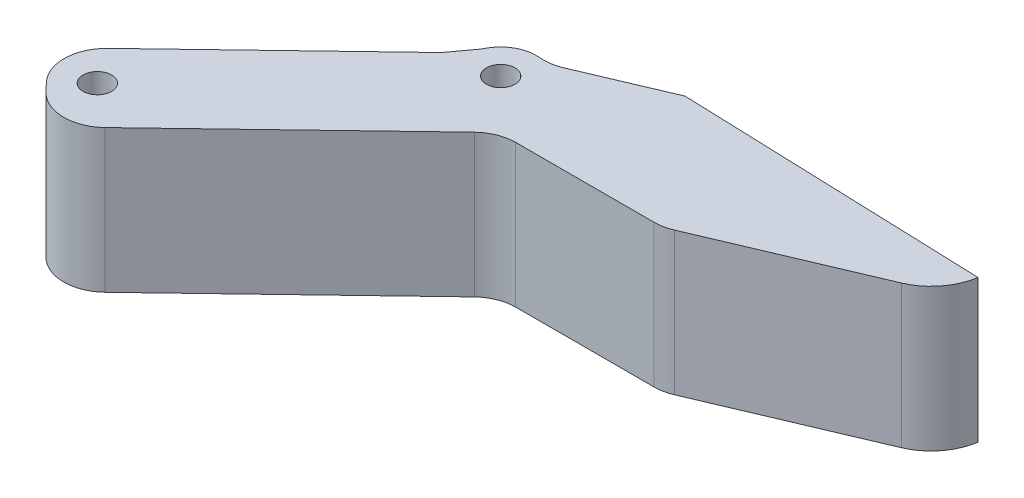
ISO-10303-21;
HEADER;
FILE_DESCRIPTION(('STEP AP214'),'2;1');
FILE_NAME('part.step','',(''),(''),'','','');
FILE_SCHEMA(('AUTOMOTIVE_DESIGN { 1 0 10303 214 1 1 1 1 }'));
ENDSEC;
DATA;
#1=APPLICATION_CONTEXT('core data for automotive mechanical design processes');
#2=APPLICATION_PROTOCOL_DEFINITION('international standard','automotive_design',2000,#1);
#3=PRODUCT_CONTEXT('',#1,'mechanical');
#4=PRODUCT('Part','Part','',(#3));
#5=PRODUCT_RELATED_PRODUCT_CATEGORY('part','',(#4));
#6=PRODUCT_DEFINITION_FORMATION('','',#4);
#7=PRODUCT_DEFINITION_CONTEXT('part definition',#1,'design');
#8=PRODUCT_DEFINITION('design','',#6,#7);
#9=PRODUCT_DEFINITION_SHAPE('','',#8);
#10=(LENGTH_UNIT() NAMED_UNIT(*) SI_UNIT(.MILLI.,.METRE.));
#11=(NAMED_UNIT(*) PLANE_ANGLE_UNIT() SI_UNIT($,.RADIAN.));
#12=(NAMED_UNIT(*) SI_UNIT($,.STERADIAN.) SOLID_ANGLE_UNIT());
#13=UNCERTAINTY_MEASURE_WITH_UNIT(LENGTH_MEASURE(1.E-05),#10,'distance_accuracy_value','');
#14=(GEOMETRIC_REPRESENTATION_CONTEXT(3) GLOBAL_UNCERTAINTY_ASSIGNED_CONTEXT((#13)) GLOBAL_UNIT_ASSIGNED_CONTEXT((#10,
#11,#12)) REPRESENTATION_CONTEXT('',''));
#15=CARTESIAN_POINT('',(0.,0.,0.));
#16=DIRECTION('',(0.,0.,1.));
#17=DIRECTION('',(1.,0.,0.));
#18=AXIS2_PLACEMENT_3D('',#15,#16,#17);
#19=CARTESIAN_POINT('',(-8.89,25.4,-1.26999999999998));
#20=DIRECTION('',(0.390731128489275,0.,0.92050485345244));
#21=DIRECTION('',(0.,-1.,0.));
#22=AXIS2_PLACEMENT_3D('',#19,#20,#21);
#23=PLANE('',#22);
#24=DIRECTION('',(-0.92050485345244,0.,0.390731128489275));
#25=VECTOR('',#24,1.);
#26=CARTESIAN_POINT('',(-8.89,0.,-1.26999999999998));
#27=LINE('',#26,#25);
#28=CARTESIAN_POINT('',(4.34638440568336,0.,-6.88851183788211));
#29=VERTEX_POINT('',#28);
#30=CARTESIAN_POINT('',(19.5010205659257,0.,-13.3212732367244));
#31=VERTEX_POINT('',#30);
#32=EDGE_CURVE('E180',#29,#31,#27,.F.);
#33=ORIENTED_EDGE('',*,*,#32,.F.);
#34=DIRECTION('',(0.,1.,0.));
#35=VECTOR('',#34,1.);
#36=CARTESIAN_POINT('',(4.34638440568335,25.4,-6.88851183788211));
#37=LINE('',#36,#35);
#38=CARTESIAN_POINT('',(4.34638440568335,25.4,-6.88851183788211));
#39=VERTEX_POINT('',#38);
#40=EDGE_CURVE('E236',#29,#39,#37,.T.);
#41=ORIENTED_EDGE('',*,*,#40,.T.);
#42=DIRECTION('',(0.92050485345244,0.,-0.390731128489275));
#43=VECTOR('',#42,1.);
#44=CARTESIAN_POINT('',(-1.8140243165248,25.4,-4.27357347774675));
#45=LINE('',#44,#43);
#46=CARTESIAN_POINT('',(19.5010205659257,25.4,-13.3212732367244));
#47=VERTEX_POINT('',#46);
#48=EDGE_CURVE('E179',#47,#39,#45,.F.);
#49=ORIENTED_EDGE('',*,*,#48,.F.);
#50=DIRECTION('',(0.,-1.,0.));
#51=VECTOR('',#50,1.);
#52=CARTESIAN_POINT('',(19.5010205659257,25.4,-13.3212732367244));
#53=LINE('',#52,#51);
#54=EDGE_CURVE('E186',#47,#31,#53,.T.);
#55=ORIENTED_EDGE('',*,*,#54,.T.);
#56=EDGE_LOOP('',(#33,#41,#49,#55));
#57=FACE_BOUND('',#56,.T.);
#58=ADVANCED_FACE('F39',(#57),#23,.F.);
#59=CARTESIAN_POINT('',(0.,25.4,0.));
#60=DIRECTION('',(0.,1.,0.));
#61=DIRECTION('',(0.,0.,1.));
#62=AXIS2_PLACEMENT_3D('',#59,#60,#61);
#63=PLANE('',#62);
#64=DIRECTION('',(0.590673831710925,0.,-0.806910419149446));
#65=VECTOR('',#64,1.);
#66=CARTESIAN_POINT('',(-5.80188098417422,25.4,-2.58082875167601));
#67=LINE('',#66,#65);
#68=CARTESIAN_POINT('',(-8.49451664572613,25.4,1.09753933174861));
#69=VERTEX_POINT('',#68);
#70=CARTESIAN_POINT('',(-6.18933525078564,25.4,-2.05153344877241));
#71=VERTEX_POINT('',#70);
#72=EDGE_CURVE('E260',#69,#71,#67,.T.);
#73=ORIENTED_EDGE('',*,*,#72,.F.);
#74=CARTESIAN_POINT('',(-14.6431740396449,25.4,-3.40339526588864));
#75=DIRECTION('',(0.,1.,0.));
#76=DIRECTION('',(0.,0.,1.));
#77=AXIS2_PLACEMENT_3D('',#74,#75,#76);
#78=CIRCLE('',#77,7.62);
#79=CARTESIAN_POINT('',(-9.37363864555082,25.4,2.1008210026086));
#80=VERTEX_POINT('',#79);
#81=EDGE_CURVE('E251',#69,#80,#78,.F.);
#82=ORIENTED_EDGE('',*,*,#81,.T.);
#83=DIRECTION('',(-0.72233809297864,0.,0.691540077965104));
#84=VECTOR('',#83,1.);
#85=CARTESIAN_POINT('',(-3.43331928897438,25.4,-3.58622354192707));
#86=LINE('',#85,#84);
#87=CARTESIAN_POINT('',(-39.2107250342065,25.4,30.6657565196845));
#88=VERTEX_POINT('',#87);
#89=EDGE_CURVE('E282',#80,#88,#86,.T.);
#90=ORIENTED_EDGE('',*,*,#89,.T.);
#91=CARTESIAN_POINT('',(-33.9411896401123,25.4,36.1699727881817));
#92=DIRECTION('',(0.,1.,0.));
#93=DIRECTION('',(0.,0.,1.));
#94=AXIS2_PLACEMENT_3D('',#91,#92,#93);
#95=CIRCLE('',#94,7.62);
#96=CARTESIAN_POINT('',(-39.4454059086096,25.4,41.4395081822758));
#97=VERTEX_POINT('',#96);
#98=EDGE_CURVE('E202',#88,#97,#95,.T.);
#99=ORIENTED_EDGE('',*,*,#98,.T.);
#100=DIRECTION('',(0.691540077965104,0.,0.72233809297864));
#101=VECTOR('',#100,1.);
#102=CARTESIAN_POINT('',(-44.7149413027037,25.4,35.9352919137786));
#103=LINE('',#102,#101);
#104=CARTESIAN_POINT('',(-38.0401964701845,25.4,42.9072991872084));
#105=VERTEX_POINT('',#104);
#106=EDGE_CURVE('E295',#97,#105,#103,.T.);
#107=ORIENTED_EDGE('',*,*,#106,.T.);
#108=CARTESIAN_POINT('',(-32.5359802016873,25.4,37.6377637931143));
#109=DIRECTION('',(0.,1.,0.));
#110=DIRECTION('',(0.,0.,1.));
#111=AXIS2_PLACEMENT_3D('',#108,#109,#110);
#112=CIRCLE('',#111,7.62);
#113=CARTESIAN_POINT('',(-27.2664448075932,25.4,43.1419800616116));
#114=VERTEX_POINT('',#113);
#115=EDGE_CURVE('E204',#105,#114,#112,.T.);
#116=ORIENTED_EDGE('',*,*,#115,.T.);
#117=DIRECTION('',(0.72233809297864,0.,-0.691540077965104));
#118=VECTOR('',#117,1.);
#119=CARTESIAN_POINT('',(8.51096093763888,25.4,8.89));
#120=LINE('',#119,#118);
#121=CARTESIAN_POINT('',(6.30094992820313,25.4,11.0057837315028));
#122=VERTEX_POINT('',#121);
#123=EDGE_CURVE('E287',#114,#122,#120,.T.);
#124=ORIENTED_EDGE('',*,*,#123,.T.);
#125=CARTESIAN_POINT('',(11.5704853222972,25.4,16.51));
#126=DIRECTION('',(0.,1.,0.));
#127=DIRECTION('',(0.,0.,1.));
#128=AXIS2_PLACEMENT_3D('',#125,#126,#127);
#129=CIRCLE('',#128,7.62);
#130=CARTESIAN_POINT('',(11.5704853222972,25.4,8.89));
#131=VERTEX_POINT('',#130);
#132=EDGE_CURVE('E229',#122,#131,#129,.F.);
#133=ORIENTED_EDGE('',*,*,#132,.T.);
#134=DIRECTION('',(1.,0.,0.));
#135=VECTOR('',#134,1.);
#136=CARTESIAN_POINT('',(-8.89,25.4,8.89));
#137=LINE('',#136,#135);
#138=CARTESIAN_POINT('',(36.2065034232375,25.4,8.89));
#139=VERTEX_POINT('',#138);
#140=EDGE_CURVE('E306',#131,#139,#137,.T.);
#141=ORIENTED_EDGE('',*,*,#140,.T.);
#142=CARTESIAN_POINT('',(36.2065034232375,25.4,1.27));
#143=DIRECTION('',(0.,1.,0.));
#144=DIRECTION('',(0.,0.,1.));
#145=AXIS2_PLACEMENT_3D('',#142,#143,#144);
#146=CIRCLE('',#145,7.62);
#147=CARTESIAN_POINT('',(39.1838746223258,25.4,8.28424698330759));
#148=VERTEX_POINT('',#147);
#149=EDGE_CURVE('E224',#139,#148,#146,.T.);
#150=ORIENTED_EDGE('',*,*,#149,.T.);
#151=DIRECTION('',(-0.92050485345244,0.,0.390731128489275));
#152=VECTOR('',#151,1.);
#153=CARTESIAN_POINT('',(8.96182834991997,25.4,21.1127445202653));
#154=LINE('',#153,#152);
#155=CARTESIAN_POINT('',(67.5673112848928,25.4,-3.76380707743254));
#156=VERTEX_POINT('',#155);
#157=EDGE_CURVE('E170',#148,#156,#154,.F.);
#158=ORIENTED_EDGE('',*,*,#157,.T.);
#159=CARTESIAN_POINT('',(63.66,25.4,-12.9688556119569));
#160=DIRECTION('',(0.,1.,0.));
#161=DIRECTION('',(0.,0.,1.));
#162=AXIS2_PLACEMENT_3D('',#159,#160,#161);
#163=CIRCLE('',#162,10.);
#164=CARTESIAN_POINT('',(73.541530193068,25.4,-11.4341370568186));
#165=VERTEX_POINT('',#164);
#166=EDGE_CURVE('E184',#156,#165,#163,.T.);
#167=ORIENTED_EDGE('',*,*,#166,.T.);
#168=DIRECTION('',(0.999390827019096,0.,0.034899496702498));
#169=VECTOR('',#168,1.);
#170=CARTESIAN_POINT('',(0.488374276378264,25.4,-13.9852094752298));
#171=LINE('',#170,#169);
#172=EDGE_CURVE('E195',#165,#47,#171,.F.);
#173=ORIENTED_EDGE('',*,*,#172,.T.);
#174=ORIENTED_EDGE('',*,*,#48,.T.);
#175=CARTESIAN_POINT('',(1.36901320659508,25.4,-13.9027588211897));
#176=DIRECTION('',(0.,1.,0.));
#177=DIRECTION('',(0.,0.,1.));
#178=AXIS2_PLACEMENT_3D('',#175,#176,#177);
#179=CIRCLE('',#178,7.62);
#180=CARTESIAN_POINT('',(0.62227873027049,25.4,-6.3194358278135));
#181=VERTEX_POINT('',#180);
#182=EDGE_CURVE('E240',#39,#181,#179,.F.);
#183=ORIENTED_EDGE('',*,*,#182,.T.);
#184=CARTESIAN_POINT('',(0.,25.4,0.));
#185=DIRECTION('',(0.,1.,0.));
#186=DIRECTION('',(0.,0.,1.));
#187=AXIS2_PLACEMENT_3D('',#184,#185,#186);
#188=CIRCLE('',#187,6.35);
#189=CARTESIAN_POINT('',(-5.60817847486565,25.4,-2.97839456654985));
#190=VERTEX_POINT('',#189);
#191=EDGE_CURVE('E262',#181,#190,#188,.T.);
#192=ORIENTED_EDGE('',*,*,#191,.T.);
#193=CARTESIAN_POINT('',(-12.3379926447044,25.4,-6.55246804640966));
#194=DIRECTION('',(0.,1.,0.));
#195=DIRECTION('',(0.,0.,1.));
#196=AXIS2_PLACEMENT_3D('',#193,#194,#195);
#197=CIRCLE('',#196,7.62);
#198=EDGE_CURVE('E47',#190,#71,#197,.F.);
#199=ORIENTED_EDGE('',*,*,#198,.T.);
#200=EDGE_LOOP('',(#73,#82,#90,#99,#107,#116,#124,#133,#141,#150,#158,#167,#173,#174,#183,#192,#199));
#201=FACE_BOUND('',#200,.T.);
#202=CARTESIAN_POINT('',(-34.8083991234712,25.4,37.0002074380824));
#203=DIRECTION('',(0.,1.,0.));
#204=DIRECTION('',(0.,0.,1.));
#205=AXIS2_PLACEMENT_3D('',#202,#203,#204);
#206=CIRCLE('',#205,2.54);
#207=CARTESIAN_POINT('',(-34.8083991234712,25.4,39.5402074380824));
#208=VERTEX_POINT('',#207);
#209=EDGE_CURVE('E273',#208,#208,#206,.T.);
#210=ORIENTED_EDGE('',*,*,#209,.F.);
#211=EDGE_LOOP('',(#210));
#212=FACE_BOUND('',#211,.T.);
#213=CARTESIAN_POINT('',(0.,25.4,0.));
#214=DIRECTION('',(0.,1.,0.));
#215=DIRECTION('',(0.,0.,1.));
#216=AXIS2_PLACEMENT_3D('',#213,#214,#215);
#217=CIRCLE('',#216,2.54);
#218=CARTESIAN_POINT('',(0.,25.4,2.54));
#219=VERTEX_POINT('',#218);
#220=EDGE_CURVE('E300',#219,#219,#217,.T.);
#221=ORIENTED_EDGE('',*,*,#220,.F.);
#222=EDGE_LOOP('',(#221));
#223=FACE_BOUND('',#222,.T.);
#224=ADVANCED_FACE('F258',(#201,#212,#223),#63,.T.);
#225=CARTESIAN_POINT('',(0.,0.,0.));
#226=DIRECTION('',(0.,1.,0.));
#227=DIRECTION('',(0.,0.,1.));
#228=AXIS2_PLACEMENT_3D('',#225,#226,#227);
#229=PLANE('',#228);
#230=CARTESIAN_POINT('',(-34.8083991234712,0.,37.0002074380824));
#231=DIRECTION('',(0.,1.,0.));
#232=DIRECTION('',(0.,0.,1.));
#233=AXIS2_PLACEMENT_3D('',#230,#231,#232);
#234=CIRCLE('',#233,2.54);
#235=CARTESIAN_POINT('',(-34.8083991234712,0.,39.5402074380824));
#236=VERTEX_POINT('',#235);
#237=EDGE_CURVE('E276',#236,#236,#234,.T.);
#238=ORIENTED_EDGE('',*,*,#237,.T.);
#239=EDGE_LOOP('',(#238));
#240=FACE_BOUND('',#239,.T.);
#241=DIRECTION('',(-0.72233809297864,0.,0.691540077965104));
#242=VECTOR('',#241,1.);
#243=CARTESIAN_POINT('',(-3.43331928897438,0.,-3.58622354192707));
#244=LINE('',#243,#242);
#245=CARTESIAN_POINT('',(-9.37363864555082,0.,2.1008210026086));
#246=VERTEX_POINT('',#245);
#247=CARTESIAN_POINT('',(-39.2107250342065,0.,30.6657565196845));
#248=VERTEX_POINT('',#247);
#249=EDGE_CURVE('E284',#246,#248,#244,.T.);
#250=ORIENTED_EDGE('',*,*,#249,.F.);
#251=CARTESIAN_POINT('',(-14.6431740396449,0.,-3.40339526588864));
#252=DIRECTION('',(0.,1.,0.));
#253=DIRECTION('',(0.,0.,1.));
#254=AXIS2_PLACEMENT_3D('',#251,#252,#253);
#255=CIRCLE('',#254,7.62);
#256=CARTESIAN_POINT('',(-8.49451664572613,0.,1.09753933174861));
#257=VERTEX_POINT('',#256);
#258=EDGE_CURVE('E253',#246,#257,#255,.T.);
#259=ORIENTED_EDGE('',*,*,#258,.T.);
#260=DIRECTION('',(0.590673831710925,0.,-0.806910419149446));
#261=VECTOR('',#260,1.);
#262=CARTESIAN_POINT('',(-5.80188098417422,0.,-2.58082875167601));
#263=LINE('',#262,#261);
#264=CARTESIAN_POINT('',(-6.18933525078564,0.,-2.05153344877241));
#265=VERTEX_POINT('',#264);
#266=EDGE_CURVE('E267',#257,#265,#263,.T.);
#267=ORIENTED_EDGE('',*,*,#266,.T.);
#268=CARTESIAN_POINT('',(-12.3379926447044,0.,-6.55246804640966));
#269=DIRECTION('',(0.,1.,0.));
#270=DIRECTION('',(0.,0.,1.));
#271=AXIS2_PLACEMENT_3D('',#268,#269,#270);
#272=CIRCLE('',#271,7.62);
#273=CARTESIAN_POINT('',(-5.60817847486565,0.,-2.97839456654985));
#274=VERTEX_POINT('',#273);
#275=EDGE_CURVE('E11',#265,#274,#272,.T.);
#276=ORIENTED_EDGE('',*,*,#275,.T.);
#277=CARTESIAN_POINT('',(0.,0.,0.));
#278=DIRECTION('',(0.,1.,0.));
#279=DIRECTION('',(0.,0.,1.));
#280=AXIS2_PLACEMENT_3D('',#277,#278,#279);
#281=CIRCLE('',#280,6.35);
#282=CARTESIAN_POINT('',(0.62227873027049,0.,-6.3194358278135));
#283=VERTEX_POINT('',#282);
#284=EDGE_CURVE('E272',#283,#274,#281,.T.);
#285=ORIENTED_EDGE('',*,*,#284,.F.);
#286=CARTESIAN_POINT('',(1.36901320659508,0.,-13.9027588211897));
#287=DIRECTION('',(0.,1.,0.));
#288=DIRECTION('',(0.,0.,1.));
#289=AXIS2_PLACEMENT_3D('',#286,#287,#288);
#290=CIRCLE('',#289,7.62);
#291=EDGE_CURVE('E238',#283,#29,#290,.T.);
#292=ORIENTED_EDGE('',*,*,#291,.T.);
#293=ORIENTED_EDGE('',*,*,#32,.T.);
#294=DIRECTION('',(-0.999390827019096,0.,-0.034899496702498));
#295=VECTOR('',#294,1.);
#296=CARTESIAN_POINT('',(-71.8121666772531,0.,-16.51));
#297=LINE('',#296,#295);
#298=CARTESIAN_POINT('',(73.541530193068,0.,-11.4341370568186));
#299=VERTEX_POINT('',#298);
#300=EDGE_CURVE('E165',#31,#299,#297,.F.);
#301=ORIENTED_EDGE('',*,*,#300,.T.);
#302=CARTESIAN_POINT('',(63.66,0.,-12.9688556119569));
#303=DIRECTION('',(0.,1.,0.));
#304=DIRECTION('',(0.,0.,1.));
#305=AXIS2_PLACEMENT_3D('',#302,#303,#304);
#306=CIRCLE('',#305,10.);
#307=CARTESIAN_POINT('',(67.5673112848928,0.,-3.76380707743253));
#308=VERTEX_POINT('',#307);
#309=EDGE_CURVE('E157',#299,#308,#306,.F.);
#310=ORIENTED_EDGE('',*,*,#309,.T.);
#311=DIRECTION('',(0.92050485345244,0.,-0.390731128489275));
#312=VECTOR('',#311,1.);
#313=CARTESIAN_POINT('',(73.66,0.,-6.35000000000003));
#314=LINE('',#313,#312);
#315=CARTESIAN_POINT('',(39.1838746223258,0.,8.2842469833076));
#316=VERTEX_POINT('',#315);
#317=EDGE_CURVE('E162',#308,#316,#314,.F.);
#318=ORIENTED_EDGE('',*,*,#317,.T.);
#319=CARTESIAN_POINT('',(36.2065034232375,0.,1.27));
#320=DIRECTION('',(0.,1.,0.));
#321=DIRECTION('',(0.,0.,1.));
#322=AXIS2_PLACEMENT_3D('',#319,#320,#321);
#323=CIRCLE('',#322,7.62);
#324=CARTESIAN_POINT('',(36.2065034232375,0.,8.89));
#325=VERTEX_POINT('',#324);
#326=EDGE_CURVE('E227',#316,#325,#323,.F.);
#327=ORIENTED_EDGE('',*,*,#326,.T.);
#328=DIRECTION('',(1.,0.,0.));
#329=VECTOR('',#328,1.);
#330=CARTESIAN_POINT('',(-8.89,0.,8.89));
#331=LINE('',#330,#329);
#332=CARTESIAN_POINT('',(11.5704853222972,0.,8.89));
#333=VERTEX_POINT('',#332);
#334=EDGE_CURVE('E303',#333,#325,#331,.T.);
#335=ORIENTED_EDGE('',*,*,#334,.F.);
#336=CARTESIAN_POINT('',(11.5704853222972,0.,16.51));
#337=DIRECTION('',(0.,1.,0.));
#338=DIRECTION('',(0.,0.,1.));
#339=AXIS2_PLACEMENT_3D('',#336,#337,#338);
#340=CIRCLE('',#339,7.62);
#341=CARTESIAN_POINT('',(6.30094992820313,0.,11.0057837315028));
#342=VERTEX_POINT('',#341);
#343=EDGE_CURVE('E231',#333,#342,#340,.T.);
#344=ORIENTED_EDGE('',*,*,#343,.T.);
#345=DIRECTION('',(0.72233809297864,0.,-0.691540077965104));
#346=VECTOR('',#345,1.);
#347=CARTESIAN_POINT('',(8.51096093763888,0.,8.89));
#348=LINE('',#347,#346);
#349=CARTESIAN_POINT('',(-27.2664448075932,0.,43.1419800616116));
#350=VERTEX_POINT('',#349);
#351=EDGE_CURVE('E290',#350,#342,#348,.T.);
#352=ORIENTED_EDGE('',*,*,#351,.F.);
#353=CARTESIAN_POINT('',(-32.5359802016873,0.,37.6377637931143));
#354=DIRECTION('',(0.,1.,0.));
#355=DIRECTION('',(0.,0.,1.));
#356=AXIS2_PLACEMENT_3D('',#353,#354,#355);
#357=CIRCLE('',#356,7.62);
#358=CARTESIAN_POINT('',(-38.0401964701845,0.,42.9072991872084));
#359=VERTEX_POINT('',#358);
#360=EDGE_CURVE('E211',#350,#359,#357,.F.);
#361=ORIENTED_EDGE('',*,*,#360,.T.);
#362=DIRECTION('',(0.691540077965104,0.,0.72233809297864));
#363=VECTOR('',#362,1.);
#364=CARTESIAN_POINT('',(-44.7149413027037,0.,35.9352919137786));
#365=LINE('',#364,#363);
#366=CARTESIAN_POINT('',(-39.4454059086096,0.,41.4395081822758));
#367=VERTEX_POINT('',#366);
#368=EDGE_CURVE('E286',#367,#359,#365,.T.);
#369=ORIENTED_EDGE('',*,*,#368,.F.);
#370=CARTESIAN_POINT('',(-33.9411896401123,0.,36.1699727881817));
#371=DIRECTION('',(0.,1.,0.));
#372=DIRECTION('',(0.,0.,1.));
#373=AXIS2_PLACEMENT_3D('',#370,#371,#372);
#374=CIRCLE('',#373,7.62);
#375=EDGE_CURVE('E208',#367,#248,#374,.F.);
#376=ORIENTED_EDGE('',*,*,#375,.T.);
#377=EDGE_LOOP('',(#250,#259,#267,#276,#285,#292,#293,#301,#310,#318,#327,#335,#344,#352,#361,
#369,#376));
#378=FACE_BOUND('',#377,.T.);
#379=CARTESIAN_POINT('',(0.,0.,0.));
#380=DIRECTION('',(0.,1.,0.));
#381=DIRECTION('',(0.,0.,1.));
#382=AXIS2_PLACEMENT_3D('',#379,#380,#381);
#383=CIRCLE('',#382,2.54);
#384=CARTESIAN_POINT('',(0.,0.,2.54));
#385=VERTEX_POINT('',#384);
#386=EDGE_CURVE('E293',#385,#385,#383,.T.);
#387=ORIENTED_EDGE('',*,*,#386,.T.);
#388=EDGE_LOOP('',(#387));
#389=FACE_BOUND('',#388,.T.);
#390=ADVANCED_FACE('F160',(#240,#378,#389),#229,.F.);
#391=CARTESIAN_POINT('',(-8.89,25.4,8.89));
#392=DIRECTION('',(0.,0.,-1.));
#393=DIRECTION('',(-1.,0.,0.));
#394=AXIS2_PLACEMENT_3D('',#391,#392,#393);
#395=PLANE('',#394);
#396=ORIENTED_EDGE('',*,*,#140,.F.);
#397=DIRECTION('',(0.,1.,0.));
#398=VECTOR('',#397,1.);
#399=CARTESIAN_POINT('',(11.5704853222972,25.4,8.89));
#400=LINE('',#399,#398);
#401=EDGE_CURVE('E222',#131,#333,#400,.F.);
#402=ORIENTED_EDGE('',*,*,#401,.T.);
#403=ORIENTED_EDGE('',*,*,#334,.T.);
#404=DIRECTION('',(0.,-1.,0.));
#405=VECTOR('',#404,1.);
#406=CARTESIAN_POINT('',(36.2065034232375,25.4,8.89));
#407=LINE('',#406,#405);
#408=EDGE_CURVE('E219',#325,#139,#407,.F.);
#409=ORIENTED_EDGE('',*,*,#408,.T.);
#410=EDGE_LOOP('',(#396,#402,#403,#409));
#411=FACE_BOUND('',#410,.T.);
#412=ADVANCED_FACE('F321',(#411),#395,.F.);
#413=CARTESIAN_POINT('',(0.,25.4,0.));
#414=DIRECTION('',(0.,-1.,0.));
#415=DIRECTION('',(0.,0.,-1.));
#416=AXIS2_PLACEMENT_3D('',#413,#414,#415);
#417=CYLINDRICAL_SURFACE('',#416,2.54);
#418=ORIENTED_EDGE('',*,*,#220,.T.);
#419=EDGE_LOOP('',(#418));
#420=FACE_BOUND('',#419,.T.);
#421=ORIENTED_EDGE('',*,*,#386,.F.);
#422=EDGE_LOOP('',(#421));
#423=FACE_BOUND('',#422,.T.);
#424=ADVANCED_FACE('F494',(#420,#423),#417,.F.);
#425=CARTESIAN_POINT('',(73.66,25.4,-6.35000000000003));
#426=DIRECTION('',(-0.390731128489275,0.,-0.92050485345244));
#427=DIRECTION('',(0.,-1.,0.));
#428=AXIS2_PLACEMENT_3D('',#425,#426,#427);
#429=PLANE('',#428);
#430=ORIENTED_EDGE('',*,*,#157,.F.);
#431=DIRECTION('',(0.,1.,0.));
#432=VECTOR('',#431,1.);
#433=CARTESIAN_POINT('',(39.1838746223258,0.,8.28424698330759));
#434=LINE('',#433,#432);
#435=EDGE_CURVE('E178',#148,#316,#434,.F.);
#436=ORIENTED_EDGE('',*,*,#435,.T.);
#437=ORIENTED_EDGE('',*,*,#317,.F.);
#438=DIRECTION('',(0.,-1.,0.));
#439=VECTOR('',#438,1.);
#440=CARTESIAN_POINT('',(67.5673112848928,25.4,-3.76380707743253));
#441=LINE('',#440,#439);
#442=EDGE_CURVE('E169',#308,#156,#441,.F.);
#443=ORIENTED_EDGE('',*,*,#442,.T.);
#444=EDGE_LOOP('',(#430,#436,#437,#443));
#445=FACE_BOUND('',#444,.T.);
#446=ADVANCED_FACE('F175',(#445),#429,.F.);
#447=CARTESIAN_POINT('',(63.66,25.4,-12.9688556119569));
#448=DIRECTION('',(0.,-1.,0.));
#449=DIRECTION('',(0.,0.,-1.));
#450=AXIS2_PLACEMENT_3D('',#447,#448,#449);
#451=CYLINDRICAL_SURFACE('',#450,10.);
#452=ORIENTED_EDGE('',*,*,#309,.F.);
#453=DIRECTION('',(0.,-1.,0.));
#454=VECTOR('',#453,1.);
#455=CARTESIAN_POINT('',(73.541530193068,12.7,-11.4341370568186));
#456=LINE('',#455,#454);
#457=EDGE_CURVE('E193',#299,#165,#456,.F.);
#458=ORIENTED_EDGE('',*,*,#457,.T.);
#459=ORIENTED_EDGE('',*,*,#166,.F.);
#460=ORIENTED_EDGE('',*,*,#442,.F.);
#461=EDGE_LOOP('',(#452,#458,#459,#460));
#462=FACE_BOUND('',#461,.T.);
#463=ADVANCED_FACE('F182',(#462),#451,.T.);
#464=CARTESIAN_POINT('',(-71.8121666772531,25.4,-16.51));
#465=DIRECTION('',(-0.034899496702498,0.,0.999390827019096));
#466=DIRECTION('',(0.,-1.,0.));
#467=AXIS2_PLACEMENT_3D('',#464,#465,#466);
#468=PLANE('',#467);
#469=ORIENTED_EDGE('',*,*,#172,.F.);
#470=ORIENTED_EDGE('',*,*,#457,.F.);
#471=ORIENTED_EDGE('',*,*,#300,.F.);
#472=ORIENTED_EDGE('',*,*,#54,.F.);
#473=EDGE_LOOP('',(#469,#470,#471,#472));
#474=FACE_BOUND('',#473,.T.);
#475=ADVANCED_FACE('F353',(#474),#468,.F.);
#476=CARTESIAN_POINT('',(-3.43331928897438,0.,-3.58622354192707));
#477=DIRECTION('',(-0.691540077965103,0.,-0.72233809297864));
#478=DIRECTION('',(-0.72233809297864,0.,0.691540077965104));
#479=AXIS2_PLACEMENT_3D('',#476,#477,#478);
#480=PLANE('',#479);
#481=ORIENTED_EDGE('',*,*,#89,.F.);
#482=DIRECTION('',(0.,1.,0.));
#483=VECTOR('',#482,1.);
#484=CARTESIAN_POINT('',(-9.37363864555081,0.,2.1008210026086));
#485=LINE('',#484,#483);
#486=EDGE_CURVE('E247',#80,#246,#485,.F.);
#487=ORIENTED_EDGE('',*,*,#486,.T.);
#488=ORIENTED_EDGE('',*,*,#249,.T.);
#489=DIRECTION('',(0.,1.,0.));
#490=VECTOR('',#489,1.);
#491=CARTESIAN_POINT('',(-39.2107250342064,0.,30.6657565196845));
#492=LINE('',#491,#490);
#493=EDGE_CURVE('E213',#248,#88,#492,.T.);
#494=ORIENTED_EDGE('',*,*,#493,.T.);
#495=EDGE_LOOP('',(#481,#487,#488,#494));
#496=FACE_BOUND('',#495,.T.);
#497=ADVANCED_FACE('F351',(#496),#480,.T.);
#498=CARTESIAN_POINT('',(8.51096093763888,0.,8.89));
#499=DIRECTION('',(0.691540077965103,0.,0.72233809297864));
#500=DIRECTION('',(0.72233809297864,0.,-0.691540077965104));
#501=AXIS2_PLACEMENT_3D('',#498,#499,#500);
#502=PLANE('',#501);
#503=ORIENTED_EDGE('',*,*,#351,.T.);
#504=DIRECTION('',(0.,1.,0.));
#505=VECTOR('',#504,1.);
#506=CARTESIAN_POINT('',(6.30094992820313,0.,11.0057837315028));
#507=LINE('',#506,#505);
#508=EDGE_CURVE('E216',#342,#122,#507,.T.);
#509=ORIENTED_EDGE('',*,*,#508,.T.);
#510=ORIENTED_EDGE('',*,*,#123,.F.);
#511=DIRECTION('',(0.,1.,0.));
#512=VECTOR('',#511,1.);
#513=CARTESIAN_POINT('',(-27.2664448075932,0.,43.1419800616116));
#514=LINE('',#513,#512);
#515=EDGE_CURVE('E206',#114,#350,#514,.F.);
#516=ORIENTED_EDGE('',*,*,#515,.T.);
#517=EDGE_LOOP('',(#503,#509,#510,#516));
#518=FACE_BOUND('',#517,.T.);
#519=ADVANCED_FACE('F329',(#518),#502,.T.);
#520=CARTESIAN_POINT('',(-44.7149413027037,0.,35.9352919137786));
#521=DIRECTION('',(-0.72233809297864,0.,0.691540077965104));
#522=DIRECTION('',(0.691540077965104,0.,0.72233809297864));
#523=AXIS2_PLACEMENT_3D('',#520,#521,#522);
#524=PLANE('',#523);
#525=ORIENTED_EDGE('',*,*,#368,.T.);
#526=DIRECTION('',(0.,1.,0.));
#527=VECTOR('',#526,1.);
#528=CARTESIAN_POINT('',(-38.0401964701845,0.,42.9072991872084));
#529=LINE('',#528,#527);
#530=EDGE_CURVE('E199',#359,#105,#529,.T.);
#531=ORIENTED_EDGE('',*,*,#530,.T.);
#532=ORIENTED_EDGE('',*,*,#106,.F.);
#533=DIRECTION('',(0.,1.,0.));
#534=VECTOR('',#533,1.);
#535=CARTESIAN_POINT('',(-39.4454059086096,0.,41.4395081822758));
#536=LINE('',#535,#534);
#537=EDGE_CURVE('E197',#97,#367,#536,.F.);
#538=ORIENTED_EDGE('',*,*,#537,.T.);
#539=EDGE_LOOP('',(#525,#531,#532,#538));
#540=FACE_BOUND('',#539,.T.);
#541=ADVANCED_FACE('F338',(#540),#524,.T.);
#542=CARTESIAN_POINT('',(-34.8083991234712,0.,37.0002074380824));
#543=DIRECTION('',(0.,1.,0.));
#544=DIRECTION('',(0.,0.,1.));
#545=AXIS2_PLACEMENT_3D('',#542,#543,#544);
#546=CYLINDRICAL_SURFACE('',#545,2.54);
#547=ORIENTED_EDGE('',*,*,#237,.F.);
#548=EDGE_LOOP('',(#547));
#549=FACE_BOUND('',#548,.T.);
#550=ORIENTED_EDGE('',*,*,#209,.T.);
#551=EDGE_LOOP('',(#550));
#552=FACE_BOUND('',#551,.T.);
#553=ADVANCED_FACE('F386',(#549,#552),#546,.F.);
#554=CARTESIAN_POINT('',(-32.5359802016873,0.,37.6377637931143));
#555=DIRECTION('',(0.,1.,0.));
#556=DIRECTION('',(0.,0.,1.));
#557=AXIS2_PLACEMENT_3D('',#554,#555,#556);
#558=CYLINDRICAL_SURFACE('',#557,7.62);
#559=ORIENTED_EDGE('',*,*,#360,.F.);
#560=ORIENTED_EDGE('',*,*,#515,.F.);
#561=ORIENTED_EDGE('',*,*,#115,.F.);
#562=ORIENTED_EDGE('',*,*,#530,.F.);
#563=EDGE_LOOP('',(#559,#560,#561,#562));
#564=FACE_BOUND('',#563,.T.);
#565=ADVANCED_FACE('F333',(#564),#558,.T.);
#566=CARTESIAN_POINT('',(-33.9411896401123,0.,36.1699727881817));
#567=DIRECTION('',(0.,1.,0.));
#568=DIRECTION('',(0.,0.,1.));
#569=AXIS2_PLACEMENT_3D('',#566,#567,#568);
#570=CYLINDRICAL_SURFACE('',#569,7.62);
#571=ORIENTED_EDGE('',*,*,#375,.F.);
#572=ORIENTED_EDGE('',*,*,#537,.F.);
#573=ORIENTED_EDGE('',*,*,#98,.F.);
#574=ORIENTED_EDGE('',*,*,#493,.F.);
#575=EDGE_LOOP('',(#571,#572,#573,#574));
#576=FACE_BOUND('',#575,.T.);
#577=ADVANCED_FACE('F343',(#576),#570,.T.);
#578=CARTESIAN_POINT('',(11.5704853222972,0.,16.51));
#579=DIRECTION('',(0.,1.,0.));
#580=DIRECTION('',(0.,0.,1.));
#581=AXIS2_PLACEMENT_3D('',#578,#579,#580);
#582=CYLINDRICAL_SURFACE('',#581,7.62);
#583=ORIENTED_EDGE('',*,*,#343,.F.);
#584=ORIENTED_EDGE('',*,*,#401,.F.);
#585=ORIENTED_EDGE('',*,*,#132,.F.);
#586=ORIENTED_EDGE('',*,*,#508,.F.);
#587=EDGE_LOOP('',(#583,#584,#585,#586));
#588=FACE_BOUND('',#587,.T.);
#589=ADVANCED_FACE('F324',(#588),#582,.F.);
#590=CARTESIAN_POINT('',(36.2065034232375,25.4,1.27));
#591=DIRECTION('',(0.,1.,0.));
#592=DIRECTION('',(0.,0.,1.));
#593=AXIS2_PLACEMENT_3D('',#590,#591,#592);
#594=CYLINDRICAL_SURFACE('',#593,7.62);
#595=ORIENTED_EDGE('',*,*,#326,.F.);
#596=ORIENTED_EDGE('',*,*,#435,.F.);
#597=ORIENTED_EDGE('',*,*,#149,.F.);
#598=ORIENTED_EDGE('',*,*,#408,.F.);
#599=EDGE_LOOP('',(#595,#596,#597,#598));
#600=FACE_BOUND('',#599,.T.);
#601=ADVANCED_FACE('F315',(#600),#594,.T.);
#602=CARTESIAN_POINT('',(0.,0.,0.));
#603=DIRECTION('',(0.,1.,0.));
#604=DIRECTION('',(0.,0.,1.));
#605=AXIS2_PLACEMENT_3D('',#602,#603,#604);
#606=CYLINDRICAL_SURFACE('',#605,6.35);
#607=ORIENTED_EDGE('',*,*,#284,.T.);
#608=DIRECTION('',(0.,1.,0.));
#609=VECTOR('',#608,1.);
#610=CARTESIAN_POINT('',(-5.60817847486565,0.,-2.97839456654985));
#611=LINE('',#610,#609);
#612=EDGE_CURVE('E249',#274,#190,#611,.T.);
#613=ORIENTED_EDGE('',*,*,#612,.T.);
#614=ORIENTED_EDGE('',*,*,#191,.F.);
#615=DIRECTION('',(0.,1.,0.));
#616=VECTOR('',#615,1.);
#617=CARTESIAN_POINT('',(0.62227873027049,0.,-6.3194358278135));
#618=LINE('',#617,#616);
#619=EDGE_CURVE('E233',#181,#283,#618,.F.);
#620=ORIENTED_EDGE('',*,*,#619,.T.);
#621=EDGE_LOOP('',(#607,#613,#614,#620));
#622=FACE_BOUND('',#621,.T.);
#623=ADVANCED_FACE('F270',(#622),#606,.T.);
#624=CARTESIAN_POINT('',(1.36901320659508,0.,-13.9027588211897));
#625=DIRECTION('',(0.,1.,0.));
#626=DIRECTION('',(0.,0.,1.));
#627=AXIS2_PLACEMENT_3D('',#624,#625,#626);
#628=CYLINDRICAL_SURFACE('',#627,7.62);
#629=ORIENTED_EDGE('',*,*,#182,.F.);
#630=ORIENTED_EDGE('',*,*,#40,.F.);
#631=ORIENTED_EDGE('',*,*,#291,.F.);
#632=ORIENTED_EDGE('',*,*,#619,.F.);
#633=EDGE_LOOP('',(#629,#630,#631,#632));
#634=FACE_BOUND('',#633,.T.);
#635=ADVANCED_FACE('F393',(#634),#628,.F.);
#636=CARTESIAN_POINT('',(-5.80188098417422,0.,-2.58082875167601));
#637=DIRECTION('',(0.806910419149446,0.,0.590673831710925));
#638=DIRECTION('',(0.590673831710925,0.,-0.806910419149446));
#639=AXIS2_PLACEMENT_3D('',#636,#637,#638);
#640=PLANE('',#639);
#641=ORIENTED_EDGE('',*,*,#266,.F.);
#642=DIRECTION('',(0.,1.,0.));
#643=VECTOR('',#642,1.);
#644=CARTESIAN_POINT('',(-8.49451664572613,0.,1.09753933174861));
#645=LINE('',#644,#643);
#646=EDGE_CURVE('E244',#257,#69,#645,.T.);
#647=ORIENTED_EDGE('',*,*,#646,.T.);
#648=ORIENTED_EDGE('',*,*,#72,.T.);
#649=DIRECTION('',(0.,1.,0.));
#650=VECTOR('',#649,1.);
#651=CARTESIAN_POINT('',(-6.18933525078564,0.,-2.05153344877241));
#652=LINE('',#651,#650);
#653=EDGE_CURVE('E242',#71,#265,#652,.F.);
#654=ORIENTED_EDGE('',*,*,#653,.T.);
#655=EDGE_LOOP('',(#641,#647,#648,#654));
#656=FACE_BOUND('',#655,.T.);
#657=ADVANCED_FACE('F265',(#656),#640,.F.);
#658=CARTESIAN_POINT('',(-14.6431740396449,0.,-3.40339526588864));
#659=DIRECTION('',(0.,1.,0.));
#660=DIRECTION('',(0.,0.,1.));
#661=AXIS2_PLACEMENT_3D('',#658,#659,#660);
#662=CYLINDRICAL_SURFACE('',#661,7.62);
#663=ORIENTED_EDGE('',*,*,#258,.F.);
#664=ORIENTED_EDGE('',*,*,#486,.F.);
#665=ORIENTED_EDGE('',*,*,#81,.F.);
#666=ORIENTED_EDGE('',*,*,#646,.F.);
#667=EDGE_LOOP('',(#663,#664,#665,#666));
#668=FACE_BOUND('',#667,.T.);
#669=ADVANCED_FACE('F349',(#668),#662,.F.);
#670=CARTESIAN_POINT('',(-12.3379926447044,0.,-6.55246804640966));
#671=DIRECTION('',(0.,1.,0.));
#672=DIRECTION('',(0.,0.,1.));
#673=AXIS2_PLACEMENT_3D('',#670,#671,#672);
#674=CYLINDRICAL_SURFACE('',#673,7.62);
#675=ORIENTED_EDGE('',*,*,#275,.F.);
#676=ORIENTED_EDGE('',*,*,#653,.F.);
#677=ORIENTED_EDGE('',*,*,#198,.F.);
#678=ORIENTED_EDGE('',*,*,#612,.F.);
#679=EDGE_LOOP('',(#675,#676,#677,#678));
#680=FACE_BOUND('',#679,.T.);
#681=ADVANCED_FACE('F41',(#680),#674,.F.);
#682=CLOSED_SHELL('',(#58,#224,#390,#412,#424,#446,#463,#475,#497,#519,#541,#553,#565,#577,#589,
#601,#623,#635,#657,#669,#681));
#683=MANIFOLD_SOLID_BREP('B2',#682);
#684=ADVANCED_BREP_SHAPE_REPRESENTATION('',(#18,#683),#14);
#685=SHAPE_DEFINITION_REPRESENTATION(#9,#684);
ENDSEC;
END-ISO-10303-21;
